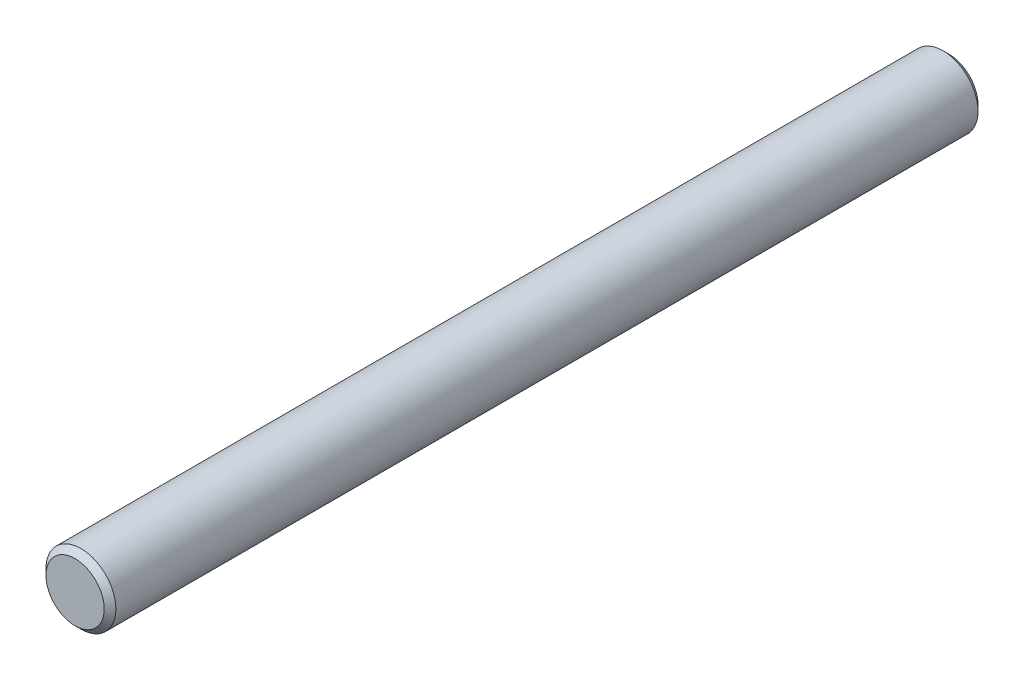
ISO-10303-21;
HEADER;
FILE_DESCRIPTION(('STEP AP214'),'2;1');
FILE_NAME('part.step','',(''),(''),'','','');
FILE_SCHEMA(('AUTOMOTIVE_DESIGN { 1 0 10303 214 1 1 1 1 }'));
ENDSEC;
DATA;
#1=APPLICATION_CONTEXT('core data for automotive mechanical design processes');
#2=APPLICATION_PROTOCOL_DEFINITION('international standard','automotive_design',2000,#1);
#3=PRODUCT_CONTEXT('',#1,'mechanical');
#4=PRODUCT('Part','Part','',(#3));
#5=PRODUCT_RELATED_PRODUCT_CATEGORY('part','',(#4));
#6=PRODUCT_DEFINITION_FORMATION('','',#4);
#7=PRODUCT_DEFINITION_CONTEXT('part definition',#1,'design');
#8=PRODUCT_DEFINITION('design','',#6,#7);
#9=PRODUCT_DEFINITION_SHAPE('','',#8);
#10=(LENGTH_UNIT() NAMED_UNIT(*) SI_UNIT(.MILLI.,.METRE.));
#11=(NAMED_UNIT(*) PLANE_ANGLE_UNIT() SI_UNIT($,.RADIAN.));
#12=(NAMED_UNIT(*) SI_UNIT($,.STERADIAN.) SOLID_ANGLE_UNIT());
#13=UNCERTAINTY_MEASURE_WITH_UNIT(LENGTH_MEASURE(1.E-05),#10,'distance_accuracy_value','');
#14=(GEOMETRIC_REPRESENTATION_CONTEXT(3) GLOBAL_UNCERTAINTY_ASSIGNED_CONTEXT((#13)) GLOBAL_UNIT_ASSIGNED_CONTEXT((#10,
#11,#12)) REPRESENTATION_CONTEXT('',''));
#15=CARTESIAN_POINT('',(0.,0.,0.));
#16=DIRECTION('',(0.,0.,1.));
#17=DIRECTION('',(1.,0.,0.));
#18=AXIS2_PLACEMENT_3D('',#15,#16,#17);
#19=CARTESIAN_POINT('',(0.,0.,37.5));
#20=DIRECTION('',(0.,0.,-1.));
#21=DIRECTION('',(-1.,0.,0.));
#22=AXIS2_PLACEMENT_3D('',#19,#20,#21);
#23=CYLINDRICAL_SURFACE('',#22,3.);
#24=CARTESIAN_POINT('',(0.,0.,37.));
#25=DIRECTION('',(0.,0.,1.));
#26=DIRECTION('',(1.,0.,0.));
#27=AXIS2_PLACEMENT_3D('',#24,#25,#26);
#28=CIRCLE('',#27,3.);
#29=CARTESIAN_POINT('',(3.,0.,37.));
#30=VERTEX_POINT('',#29);
#31=EDGE_CURVE('E54',#30,#30,#28,.F.);
#32=ORIENTED_EDGE('',*,*,#31,.T.);
#33=EDGE_LOOP('',(#32));
#34=FACE_BOUND('',#33,.T.);
#35=CARTESIAN_POINT('',(0.,0.,-37.));
#36=DIRECTION('',(0.,0.,1.));
#37=DIRECTION('',(1.,0.,0.));
#38=AXIS2_PLACEMENT_3D('',#35,#36,#37);
#39=CIRCLE('',#38,3.);
#40=CARTESIAN_POINT('',(3.,0.,-37.));
#41=VERTEX_POINT('',#40);
#42=EDGE_CURVE('E59',#41,#41,#39,.T.);
#43=ORIENTED_EDGE('',*,*,#42,.T.);
#44=EDGE_LOOP('',(#43));
#45=FACE_BOUND('',#44,.T.);
#46=ADVANCED_FACE('F45',(#34,#45),#23,.T.);
#47=CARTESIAN_POINT('',(0.,0.,37.5));
#48=DIRECTION('',(0.,0.,1.));
#49=DIRECTION('',(1.,0.,0.));
#50=AXIS2_PLACEMENT_3D('',#47,#48,#49);
#51=PLANE('',#50);
#52=CARTESIAN_POINT('',(0.,0.,37.5));
#53=DIRECTION('',(0.,0.,1.));
#54=DIRECTION('',(1.,0.,0.));
#55=AXIS2_PLACEMENT_3D('',#52,#53,#54);
#56=CIRCLE('',#55,2.5);
#57=CARTESIAN_POINT('',(2.5,0.,37.5));
#58=VERTEX_POINT('',#57);
#59=EDGE_CURVE('E64',#58,#58,#56,.T.);
#60=ORIENTED_EDGE('',*,*,#59,.T.);
#61=EDGE_LOOP('',(#60));
#62=FACE_BOUND('',#61,.T.);
#63=ADVANCED_FACE('F71',(#62),#51,.T.);
#64=CARTESIAN_POINT('',(0.,0.,-37.5));
#65=DIRECTION('',(0.,0.,1.));
#66=DIRECTION('',(1.,0.,0.));
#67=AXIS2_PLACEMENT_3D('',#64,#65,#66);
#68=PLANE('',#67);
#69=CARTESIAN_POINT('',(0.,0.,-37.5));
#70=DIRECTION('',(0.,0.,1.));
#71=DIRECTION('',(1.,0.,0.));
#72=AXIS2_PLACEMENT_3D('',#69,#70,#71);
#73=CIRCLE('',#72,2.5);
#74=CARTESIAN_POINT('',(2.5,0.,-37.5));
#75=VERTEX_POINT('',#74);
#76=EDGE_CURVE('E10',#75,#75,#73,.F.);
#77=ORIENTED_EDGE('',*,*,#76,.T.);
#78=EDGE_LOOP('',(#77));
#79=FACE_BOUND('',#78,.T.);
#80=ADVANCED_FACE('F75',(#79),#68,.F.);
#81=CARTESIAN_POINT('',(0.,0.,37.5));
#82=DIRECTION('',(0.,0.,-1.));
#83=DIRECTION('',(-1.,0.,0.));
#84=AXIS2_PLACEMENT_3D('',#81,#82,#83);
#85=CONICAL_SURFACE('',#84,2.5,0.785398163397446);
#86=ORIENTED_EDGE('',*,*,#31,.F.);
#87=EDGE_LOOP('',(#86));
#88=FACE_BOUND('',#87,.T.);
#89=ORIENTED_EDGE('',*,*,#59,.F.);
#90=EDGE_LOOP('',(#89));
#91=FACE_BOUND('',#90,.T.);
#92=ADVANCED_FACE('F73',(#88,#91),#85,.T.);
#93=CARTESIAN_POINT('',(0.,0.,-37.));
#94=DIRECTION('',(0.,0.,1.));
#95=DIRECTION('',(1.,0.,0.));
#96=AXIS2_PLACEMENT_3D('',#93,#94,#95);
#97=CONICAL_SURFACE('',#96,3.,0.78539816339746);
#98=ORIENTED_EDGE('',*,*,#76,.F.);
#99=EDGE_LOOP('',(#98));
#100=FACE_BOUND('',#99,.T.);
#101=ORIENTED_EDGE('',*,*,#42,.F.);
#102=EDGE_LOOP('',(#101));
#103=FACE_BOUND('',#102,.T.);
#104=ADVANCED_FACE('F48',(#100,#103),#97,.T.);
#105=CLOSED_SHELL('',(#46,#63,#80,#92,#104));
#106=MANIFOLD_SOLID_BREP('B2',#105);
#107=ADVANCED_BREP_SHAPE_REPRESENTATION('',(#18,#106),#14);
#108=SHAPE_DEFINITION_REPRESENTATION(#9,#107);
ENDSEC;
END-ISO-10303-21;
